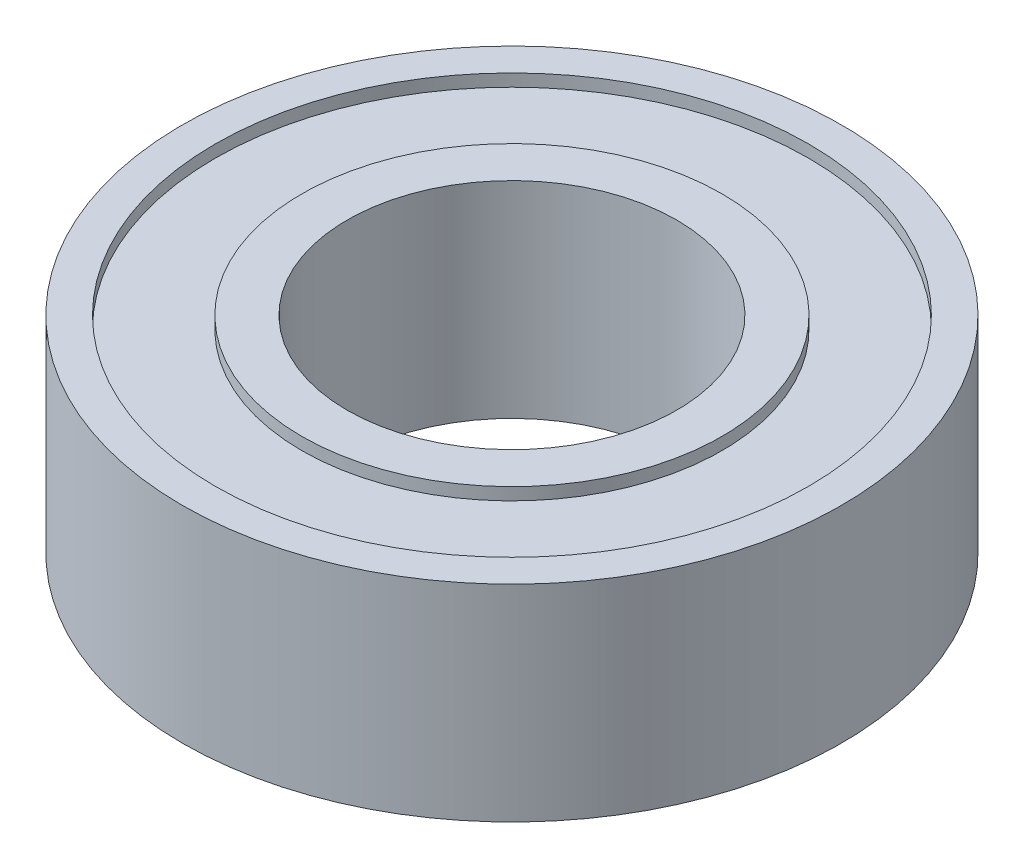
ISO-10303-21;
HEADER;
FILE_DESCRIPTION(('STEP AP214'),'2;1');
FILE_NAME('part.step','',(''),(''),'','','');
FILE_SCHEMA(('AUTOMOTIVE_DESIGN { 1 0 10303 214 1 1 1 1 }'));
ENDSEC;
DATA;
#1=APPLICATION_CONTEXT('core data for automotive mechanical design processes');
#2=APPLICATION_PROTOCOL_DEFINITION('international standard','automotive_design',2000,#1);
#3=PRODUCT_CONTEXT('',#1,'mechanical');
#4=PRODUCT('Part','Part','',(#3));
#5=PRODUCT_RELATED_PRODUCT_CATEGORY('part','',(#4));
#6=PRODUCT_DEFINITION_FORMATION('','',#4);
#7=PRODUCT_DEFINITION_CONTEXT('part definition',#1,'design');
#8=PRODUCT_DEFINITION('design','',#6,#7);
#9=PRODUCT_DEFINITION_SHAPE('','',#8);
#10=(LENGTH_UNIT() NAMED_UNIT(*) SI_UNIT(.MILLI.,.METRE.));
#11=(NAMED_UNIT(*) PLANE_ANGLE_UNIT() SI_UNIT($,.RADIAN.));
#12=(NAMED_UNIT(*) SI_UNIT($,.STERADIAN.) SOLID_ANGLE_UNIT());
#13=UNCERTAINTY_MEASURE_WITH_UNIT(LENGTH_MEASURE(1.E-05),#10,'distance_accuracy_value','');
#14=(GEOMETRIC_REPRESENTATION_CONTEXT(3) GLOBAL_UNCERTAINTY_ASSIGNED_CONTEXT((#13)) GLOBAL_UNIT_ASSIGNED_CONTEXT((#10,
#11,#12)) REPRESENTATION_CONTEXT('',''));
#15=CARTESIAN_POINT('',(0.,0.,0.));
#16=DIRECTION('',(0.,0.,1.));
#17=DIRECTION('',(1.,0.,0.));
#18=AXIS2_PLACEMENT_3D('',#15,#16,#17);
#19=CARTESIAN_POINT('',(0.,4.82499999999999,0.));
#20=DIRECTION('',(0.,1.,0.));
#21=DIRECTION('',(0.,0.,1.));
#22=AXIS2_PLACEMENT_3D('',#19,#20,#21);
#23=CYLINDRICAL_SURFACE('',#22,5.1);
#24=CARTESIAN_POINT('',(0.,2.5,0.));
#25=DIRECTION('',(0.,1.,0.));
#26=DIRECTION('',(0.,0.,1.));
#27=AXIS2_PLACEMENT_3D('',#24,#25,#26);
#28=CIRCLE('',#27,5.1);
#29=CARTESIAN_POINT('',(0.,2.5,5.1));
#30=VERTEX_POINT('',#29);
#31=EDGE_CURVE('E10',#30,#30,#28,.T.);
#32=ORIENTED_EDGE('',*,*,#31,.F.);
#33=EDGE_LOOP('',(#32));
#34=FACE_BOUND('',#33,.T.);
#35=CARTESIAN_POINT('',(0.,2.2,0.));
#36=DIRECTION('',(0.,1.,0.));
#37=DIRECTION('',(0.,0.,1.));
#38=AXIS2_PLACEMENT_3D('',#35,#36,#37);
#39=CIRCLE('',#38,5.1);
#40=CARTESIAN_POINT('',(0.,2.2,5.1));
#41=VERTEX_POINT('',#40);
#42=EDGE_CURVE('E75',#41,#41,#39,.T.);
#43=ORIENTED_EDGE('',*,*,#42,.T.);
#44=EDGE_LOOP('',(#43));
#45=FACE_BOUND('',#44,.T.);
#46=ADVANCED_FACE('F35',(#34,#45),#23,.T.);
#47=CARTESIAN_POINT('',(0.,2.5,-4.));
#48=DIRECTION('',(0.,-1.,0.));
#49=DIRECTION('',(0.,0.,-1.));
#50=AXIS2_PLACEMENT_3D('',#47,#48,#49);
#51=PLANE('',#50);
#52=CARTESIAN_POINT('',(0.,2.5,0.));
#53=DIRECTION('',(0.,1.,0.));
#54=DIRECTION('',(0.,0.,1.));
#55=AXIS2_PLACEMENT_3D('',#52,#53,#54);
#56=CIRCLE('',#55,4.);
#57=CARTESIAN_POINT('',(0.,2.5,4.));
#58=VERTEX_POINT('',#57);
#59=EDGE_CURVE('E41',#58,#58,#56,.T.);
#60=ORIENTED_EDGE('',*,*,#59,.F.);
#61=EDGE_LOOP('',(#60));
#62=FACE_BOUND('',#61,.T.);
#63=ORIENTED_EDGE('',*,*,#31,.T.);
#64=EDGE_LOOP('',(#63));
#65=FACE_BOUND('',#64,.T.);
#66=ADVANCED_FACE('F136',(#62,#65),#51,.F.);
#67=CARTESIAN_POINT('',(0.,4.82499999999999,0.));
#68=DIRECTION('',(0.,1.,0.));
#69=DIRECTION('',(0.,0.,1.));
#70=AXIS2_PLACEMENT_3D('',#67,#68,#69);
#71=CYLINDRICAL_SURFACE('',#70,4.);
#72=CARTESIAN_POINT('',(0.,-2.5,0.));
#73=DIRECTION('',(0.,1.,0.));
#74=DIRECTION('',(0.,0.,1.));
#75=AXIS2_PLACEMENT_3D('',#72,#73,#74);
#76=CIRCLE('',#75,4.);
#77=CARTESIAN_POINT('',(0.,-2.5,4.));
#78=VERTEX_POINT('',#77);
#79=EDGE_CURVE('E45',#78,#78,#76,.T.);
#80=ORIENTED_EDGE('',*,*,#79,.F.);
#81=EDGE_LOOP('',(#80));
#82=FACE_BOUND('',#81,.T.);
#83=ORIENTED_EDGE('',*,*,#59,.T.);
#84=EDGE_LOOP('',(#83));
#85=FACE_BOUND('',#84,.T.);
#86=ADVANCED_FACE('F131',(#82,#85),#71,.F.);
#87=CARTESIAN_POINT('',(0.,-2.5,-4.));
#88=DIRECTION('',(0.,1.,0.));
#89=DIRECTION('',(0.,0.,1.));
#90=AXIS2_PLACEMENT_3D('',#87,#88,#89);
#91=PLANE('',#90);
#92=CARTESIAN_POINT('',(0.,-2.5,0.));
#93=DIRECTION('',(0.,1.,0.));
#94=DIRECTION('',(0.,0.,1.));
#95=AXIS2_PLACEMENT_3D('',#92,#93,#94);
#96=CIRCLE('',#95,5.1);
#97=CARTESIAN_POINT('',(0.,-2.5,5.1));
#98=VERTEX_POINT('',#97);
#99=EDGE_CURVE('E49',#98,#98,#96,.T.);
#100=ORIENTED_EDGE('',*,*,#99,.F.);
#101=EDGE_LOOP('',(#100));
#102=FACE_BOUND('',#101,.T.);
#103=ORIENTED_EDGE('',*,*,#79,.T.);
#104=EDGE_LOOP('',(#103));
#105=FACE_BOUND('',#104,.T.);
#106=ADVANCED_FACE('F125',(#102,#105),#91,.F.);
#107=CARTESIAN_POINT('',(0.,4.82499999999999,0.));
#108=DIRECTION('',(0.,1.,0.));
#109=DIRECTION('',(0.,0.,1.));
#110=AXIS2_PLACEMENT_3D('',#107,#108,#109);
#111=CYLINDRICAL_SURFACE('',#110,5.1);
#112=CARTESIAN_POINT('',(0.,-2.2,0.));
#113=DIRECTION('',(0.,1.,0.));
#114=DIRECTION('',(0.,0.,1.));
#115=AXIS2_PLACEMENT_3D('',#112,#113,#114);
#116=CIRCLE('',#115,5.1);
#117=CARTESIAN_POINT('',(0.,-2.2,5.1));
#118=VERTEX_POINT('',#117);
#119=EDGE_CURVE('E54',#118,#118,#116,.T.);
#120=ORIENTED_EDGE('',*,*,#119,.F.);
#121=EDGE_LOOP('',(#120));
#122=FACE_BOUND('',#121,.T.);
#123=ORIENTED_EDGE('',*,*,#99,.T.);
#124=EDGE_LOOP('',(#123));
#125=FACE_BOUND('',#124,.T.);
#126=ADVANCED_FACE('F119',(#122,#125),#111,.T.);
#127=CARTESIAN_POINT('',(0.,-2.2,-5.1));
#128=DIRECTION('',(0.,1.,0.));
#129=DIRECTION('',(0.,0.,1.));
#130=AXIS2_PLACEMENT_3D('',#127,#128,#129);
#131=PLANE('',#130);
#132=CARTESIAN_POINT('',(0.,-2.2,0.));
#133=DIRECTION('',(0.,1.,0.));
#134=DIRECTION('',(0.,0.,1.));
#135=AXIS2_PLACEMENT_3D('',#132,#133,#134);
#136=CIRCLE('',#135,7.2);
#137=CARTESIAN_POINT('',(0.,-2.2,7.2));
#138=VERTEX_POINT('',#137);
#139=EDGE_CURVE('E57',#138,#138,#136,.T.);
#140=ORIENTED_EDGE('',*,*,#139,.F.);
#141=EDGE_LOOP('',(#140));
#142=FACE_BOUND('',#141,.T.);
#143=ORIENTED_EDGE('',*,*,#119,.T.);
#144=EDGE_LOOP('',(#143));
#145=FACE_BOUND('',#144,.T.);
#146=ADVANCED_FACE('F113',(#142,#145),#131,.F.);
#147=CARTESIAN_POINT('',(0.,4.82499999999999,0.));
#148=DIRECTION('',(0.,1.,0.));
#149=DIRECTION('',(0.,0.,1.));
#150=AXIS2_PLACEMENT_3D('',#147,#148,#149);
#151=CYLINDRICAL_SURFACE('',#150,7.2);
#152=CARTESIAN_POINT('',(0.,-2.5,0.));
#153=DIRECTION('',(0.,1.,0.));
#154=DIRECTION('',(0.,0.,1.));
#155=AXIS2_PLACEMENT_3D('',#152,#153,#154);
#156=CIRCLE('',#155,7.2);
#157=CARTESIAN_POINT('',(0.,-2.5,7.2));
#158=VERTEX_POINT('',#157);
#159=EDGE_CURVE('E60',#158,#158,#156,.T.);
#160=ORIENTED_EDGE('',*,*,#159,.F.);
#161=EDGE_LOOP('',(#160));
#162=FACE_BOUND('',#161,.T.);
#163=ORIENTED_EDGE('',*,*,#139,.T.);
#164=EDGE_LOOP('',(#163));
#165=FACE_BOUND('',#164,.T.);
#166=ADVANCED_FACE('F107',(#162,#165),#151,.F.);
#167=CARTESIAN_POINT('',(0.,-2.5,-7.2));
#168=DIRECTION('',(0.,1.,0.));
#169=DIRECTION('',(0.,0.,1.));
#170=AXIS2_PLACEMENT_3D('',#167,#168,#169);
#171=PLANE('',#170);
#172=CARTESIAN_POINT('',(0.,-2.5,0.));
#173=DIRECTION('',(0.,1.,0.));
#174=DIRECTION('',(0.,0.,1.));
#175=AXIS2_PLACEMENT_3D('',#172,#173,#174);
#176=CIRCLE('',#175,8.);
#177=CARTESIAN_POINT('',(0.,-2.5,8.));
#178=VERTEX_POINT('',#177);
#179=EDGE_CURVE('E63',#178,#178,#176,.T.);
#180=ORIENTED_EDGE('',*,*,#179,.F.);
#181=EDGE_LOOP('',(#180));
#182=FACE_BOUND('',#181,.T.);
#183=ORIENTED_EDGE('',*,*,#159,.T.);
#184=EDGE_LOOP('',(#183));
#185=FACE_BOUND('',#184,.T.);
#186=ADVANCED_FACE('F101',(#182,#185),#171,.F.);
#187=CARTESIAN_POINT('',(0.,4.82499999999999,0.));
#188=DIRECTION('',(0.,1.,0.));
#189=DIRECTION('',(0.,0.,1.));
#190=AXIS2_PLACEMENT_3D('',#187,#188,#189);
#191=CYLINDRICAL_SURFACE('',#190,8.);
#192=CARTESIAN_POINT('',(0.,2.5,0.));
#193=DIRECTION('',(0.,1.,0.));
#194=DIRECTION('',(0.,0.,1.));
#195=AXIS2_PLACEMENT_3D('',#192,#193,#194);
#196=CIRCLE('',#195,8.);
#197=CARTESIAN_POINT('',(0.,2.5,8.));
#198=VERTEX_POINT('',#197);
#199=EDGE_CURVE('E66',#198,#198,#196,.T.);
#200=ORIENTED_EDGE('',*,*,#199,.F.);
#201=EDGE_LOOP('',(#200));
#202=FACE_BOUND('',#201,.T.);
#203=ORIENTED_EDGE('',*,*,#179,.T.);
#204=EDGE_LOOP('',(#203));
#205=FACE_BOUND('',#204,.T.);
#206=ADVANCED_FACE('F95',(#202,#205),#191,.T.);
#207=CARTESIAN_POINT('',(0.,2.5,-7.2));
#208=DIRECTION('',(0.,-1.,0.));
#209=DIRECTION('',(0.,0.,-1.));
#210=AXIS2_PLACEMENT_3D('',#207,#208,#209);
#211=PLANE('',#210);
#212=CARTESIAN_POINT('',(0.,2.5,0.));
#213=DIRECTION('',(0.,1.,0.));
#214=DIRECTION('',(0.,0.,1.));
#215=AXIS2_PLACEMENT_3D('',#212,#213,#214);
#216=CIRCLE('',#215,7.2);
#217=CARTESIAN_POINT('',(0.,2.5,7.2));
#218=VERTEX_POINT('',#217);
#219=EDGE_CURVE('E69',#218,#218,#216,.T.);
#220=ORIENTED_EDGE('',*,*,#219,.F.);
#221=EDGE_LOOP('',(#220));
#222=FACE_BOUND('',#221,.T.);
#223=ORIENTED_EDGE('',*,*,#199,.T.);
#224=EDGE_LOOP('',(#223));
#225=FACE_BOUND('',#224,.T.);
#226=ADVANCED_FACE('F89',(#222,#225),#211,.F.);
#227=CARTESIAN_POINT('',(0.,4.82499999999999,0.));
#228=DIRECTION('',(0.,1.,0.));
#229=DIRECTION('',(0.,0.,1.));
#230=AXIS2_PLACEMENT_3D('',#227,#228,#229);
#231=CYLINDRICAL_SURFACE('',#230,7.2);
#232=CARTESIAN_POINT('',(0.,2.2,0.));
#233=DIRECTION('',(0.,1.,0.));
#234=DIRECTION('',(0.,0.,1.));
#235=AXIS2_PLACEMENT_3D('',#232,#233,#234);
#236=CIRCLE('',#235,7.2);
#237=CARTESIAN_POINT('',(0.,2.2,7.2));
#238=VERTEX_POINT('',#237);
#239=EDGE_CURVE('E72',#238,#238,#236,.T.);
#240=ORIENTED_EDGE('',*,*,#239,.F.);
#241=EDGE_LOOP('',(#240));
#242=FACE_BOUND('',#241,.T.);
#243=ORIENTED_EDGE('',*,*,#219,.T.);
#244=EDGE_LOOP('',(#243));
#245=FACE_BOUND('',#244,.T.);
#246=ADVANCED_FACE('F83',(#242,#245),#231,.F.);
#247=CARTESIAN_POINT('',(0.,2.2,-5.1));
#248=DIRECTION('',(0.,-1.,0.));
#249=DIRECTION('',(0.,0.,-1.));
#250=AXIS2_PLACEMENT_3D('',#247,#248,#249);
#251=PLANE('',#250);
#252=ORIENTED_EDGE('',*,*,#42,.F.);
#253=EDGE_LOOP('',(#252));
#254=FACE_BOUND('',#253,.T.);
#255=ORIENTED_EDGE('',*,*,#239,.T.);
#256=EDGE_LOOP('',(#255));
#257=FACE_BOUND('',#256,.T.);
#258=ADVANCED_FACE('F80',(#254,#257),#251,.F.);
#259=CLOSED_SHELL('',(#46,#66,#86,#106,#126,#146,#166,#186,#206,#226,#246,#258));
#260=MANIFOLD_SOLID_BREP('B2',#259);
#261=ADVANCED_BREP_SHAPE_REPRESENTATION('',(#18,#260),#14);
#262=SHAPE_DEFINITION_REPRESENTATION(#9,#261);
ENDSEC;
END-ISO-10303-21;
